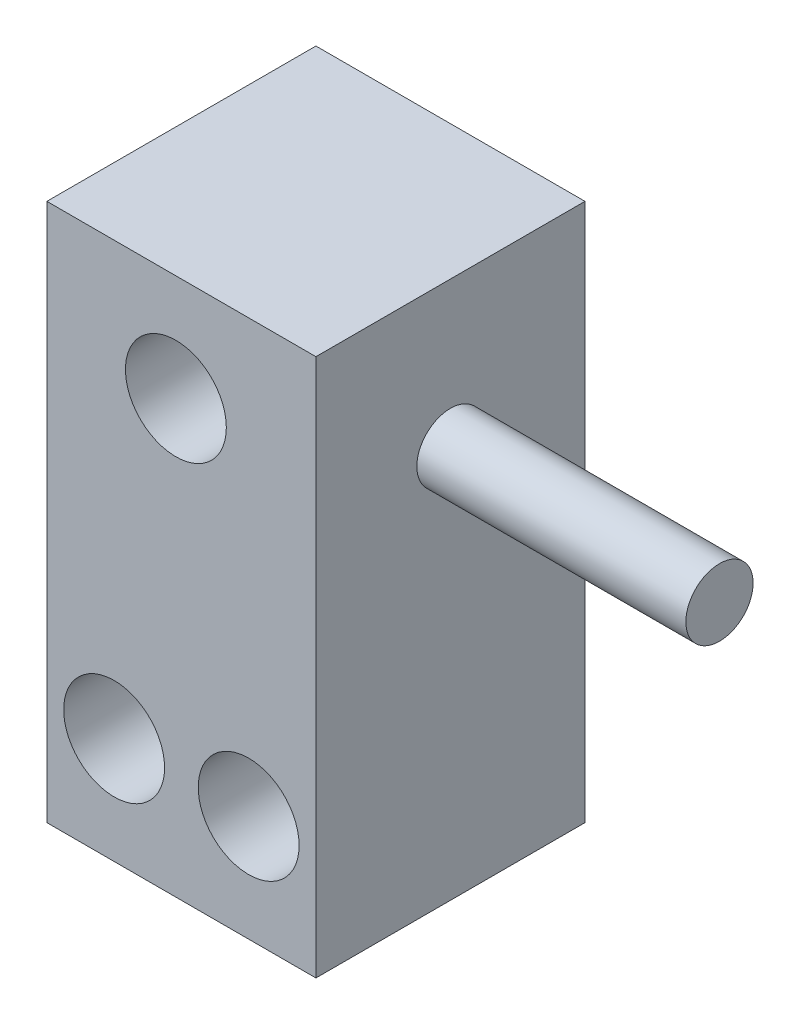
ISO-10303-21;
HEADER;
FILE_DESCRIPTION(('STEP AP214'),'2;1');
FILE_NAME('part.step','',(''),(''),'','','');
FILE_SCHEMA(('AUTOMOTIVE_DESIGN { 1 0 10303 214 1 1 1 1 }'));
ENDSEC;
DATA;
#1=APPLICATION_CONTEXT('core data for automotive mechanical design processes');
#2=APPLICATION_PROTOCOL_DEFINITION('international standard','automotive_design',2000,#1);
#3=PRODUCT_CONTEXT('',#1,'mechanical');
#4=PRODUCT('Part','Part','',(#3));
#5=PRODUCT_RELATED_PRODUCT_CATEGORY('part','',(#4));
#6=PRODUCT_DEFINITION_FORMATION('','',#4);
#7=PRODUCT_DEFINITION_CONTEXT('part definition',#1,'design');
#8=PRODUCT_DEFINITION('design','',#6,#7);
#9=PRODUCT_DEFINITION_SHAPE('','',#8);
#10=(LENGTH_UNIT() NAMED_UNIT(*) SI_UNIT(.MILLI.,.METRE.));
#11=(NAMED_UNIT(*) PLANE_ANGLE_UNIT() SI_UNIT($,.RADIAN.));
#12=(NAMED_UNIT(*) SI_UNIT($,.STERADIAN.) SOLID_ANGLE_UNIT());
#13=UNCERTAINTY_MEASURE_WITH_UNIT(LENGTH_MEASURE(1.E-05),#10,'distance_accuracy_value','');
#14=(GEOMETRIC_REPRESENTATION_CONTEXT(3) GLOBAL_UNCERTAINTY_ASSIGNED_CONTEXT((#13)) GLOBAL_UNIT_ASSIGNED_CONTEXT((#10,
#11,#12)) REPRESENTATION_CONTEXT('',''));
#15=CARTESIAN_POINT('',(0.,0.,0.));
#16=DIRECTION('',(0.,0.,1.));
#17=DIRECTION('',(1.,0.,0.));
#18=AXIS2_PLACEMENT_3D('',#15,#16,#17);
#19=CARTESIAN_POINT('',(0.,0.,20.));
#20=DIRECTION('',(0.,0.,-1.));
#21=DIRECTION('',(-1.,0.,0.));
#22=AXIS2_PLACEMENT_3D('',#19,#20,#21);
#23=PLANE('',#22);
#24=DIRECTION('',(0.,-1.,0.));
#25=VECTOR('',#24,1.);
#26=CARTESIAN_POINT('',(0.,0.,20.));
#27=LINE('',#26,#25);
#28=CARTESIAN_POINT('',(0.,40.,20.));
#29=VERTEX_POINT('',#28);
#30=CARTESIAN_POINT('',(0.,0.,20.));
#31=VERTEX_POINT('',#30);
#32=EDGE_CURVE('E88',#29,#31,#27,.T.);
#33=ORIENTED_EDGE('',*,*,#32,.T.);
#34=DIRECTION('',(1.,0.,0.));
#35=VECTOR('',#34,1.);
#36=CARTESIAN_POINT('',(0.,0.,20.));
#37=LINE('',#36,#35);
#38=CARTESIAN_POINT('',(20.,0.,20.));
#39=VERTEX_POINT('',#38);
#40=EDGE_CURVE('E83',#31,#39,#37,.T.);
#41=ORIENTED_EDGE('',*,*,#40,.T.);
#42=DIRECTION('',(0.,1.,0.));
#43=VECTOR('',#42,1.);
#44=CARTESIAN_POINT('',(20.,0.,20.));
#45=LINE('',#44,#43);
#46=CARTESIAN_POINT('',(20.,40.,20.));
#47=VERTEX_POINT('',#46);
#48=EDGE_CURVE('E86',#39,#47,#45,.T.);
#49=ORIENTED_EDGE('',*,*,#48,.T.);
#50=DIRECTION('',(-1.,0.,0.));
#51=VECTOR('',#50,1.);
#52=CARTESIAN_POINT('',(0.,40.,20.));
#53=LINE('',#52,#51);
#54=EDGE_CURVE('E52',#47,#29,#53,.T.);
#55=ORIENTED_EDGE('',*,*,#54,.T.);
#56=EDGE_LOOP('',(#33,#41,#49,#55));
#57=FACE_BOUND('',#56,.T.);
#58=CARTESIAN_POINT('',(15.,7.90672247993892,20.));
#59=DIRECTION('',(0.,0.,1.));
#60=DIRECTION('',(1.,0.,0.));
#61=AXIS2_PLACEMENT_3D('',#58,#59,#60);
#62=CIRCLE('',#61,3.75);
#63=CARTESIAN_POINT('',(18.75,7.90672247993892,20.));
#64=VERTEX_POINT('',#63);
#65=EDGE_CURVE('E105',#64,#64,#62,.T.);
#66=ORIENTED_EDGE('',*,*,#65,.F.);
#67=EDGE_LOOP('',(#66));
#68=FACE_BOUND('',#67,.T.);
#69=CARTESIAN_POINT('',(5.,7.90672247993892,20.));
#70=DIRECTION('',(0.,0.,1.));
#71=DIRECTION('',(1.,0.,0.));
#72=AXIS2_PLACEMENT_3D('',#69,#70,#71);
#73=CIRCLE('',#72,3.75);
#74=CARTESIAN_POINT('',(8.75,7.90672247993892,20.));
#75=VERTEX_POINT('',#74);
#76=EDGE_CURVE('E135',#75,#75,#73,.T.);
#77=ORIENTED_EDGE('',*,*,#76,.F.);
#78=EDGE_LOOP('',(#77));
#79=FACE_BOUND('',#78,.T.);
#80=CARTESIAN_POINT('',(9.59001599845735,32.1,20.));
#81=DIRECTION('',(0.,0.,1.));
#82=DIRECTION('',(1.,0.,0.));
#83=AXIS2_PLACEMENT_3D('',#80,#81,#82);
#84=CIRCLE('',#83,3.75);
#85=CARTESIAN_POINT('',(13.3400159984574,32.1,20.));
#86=VERTEX_POINT('',#85);
#87=EDGE_CURVE('E126',#86,#86,#84,.T.);
#88=ORIENTED_EDGE('',*,*,#87,.F.);
#89=EDGE_LOOP('',(#88));
#90=FACE_BOUND('',#89,.T.);
#91=ADVANCED_FACE('F35',(#57,#68,#79,#90),#23,.F.);
#92=CARTESIAN_POINT('',(0.,0.,0.));
#93=DIRECTION('',(0.,0.,-1.));
#94=DIRECTION('',(-1.,0.,0.));
#95=AXIS2_PLACEMENT_3D('',#92,#93,#94);
#96=PLANE('',#95);
#97=CARTESIAN_POINT('',(5.,7.90672247993892,0.));
#98=DIRECTION('',(0.,0.,1.));
#99=DIRECTION('',(1.,0.,0.));
#100=AXIS2_PLACEMENT_3D('',#97,#98,#99);
#101=CIRCLE('',#100,3.75);
#102=CARTESIAN_POINT('',(8.75,7.90672247993892,0.));
#103=VERTEX_POINT('',#102);
#104=EDGE_CURVE('E130',#103,#103,#101,.T.);
#105=ORIENTED_EDGE('',*,*,#104,.T.);
#106=EDGE_LOOP('',(#105));
#107=FACE_BOUND('',#106,.T.);
#108=DIRECTION('',(0.,-1.,0.));
#109=VECTOR('',#108,1.);
#110=CARTESIAN_POINT('',(0.,0.,0.));
#111=LINE('',#110,#109);
#112=CARTESIAN_POINT('',(0.,40.,0.));
#113=VERTEX_POINT('',#112);
#114=CARTESIAN_POINT('',(0.,0.,0.));
#115=VERTEX_POINT('',#114);
#116=EDGE_CURVE('E102',#113,#115,#111,.T.);
#117=ORIENTED_EDGE('',*,*,#116,.F.);
#118=DIRECTION('',(-1.,0.,0.));
#119=VECTOR('',#118,1.);
#120=CARTESIAN_POINT('',(0.,40.,0.));
#121=LINE('',#120,#119);
#122=CARTESIAN_POINT('',(20.,40.,0.));
#123=VERTEX_POINT('',#122);
#124=EDGE_CURVE('E75',#123,#113,#121,.T.);
#125=ORIENTED_EDGE('',*,*,#124,.F.);
#126=DIRECTION('',(0.,1.,0.));
#127=VECTOR('',#126,1.);
#128=CARTESIAN_POINT('',(20.,0.,0.));
#129=LINE('',#128,#127);
#130=CARTESIAN_POINT('',(20.,0.,0.));
#131=VERTEX_POINT('',#130);
#132=EDGE_CURVE('E69',#131,#123,#129,.T.);
#133=ORIENTED_EDGE('',*,*,#132,.F.);
#134=DIRECTION('',(1.,0.,0.));
#135=VECTOR('',#134,1.);
#136=CARTESIAN_POINT('',(0.,0.,0.));
#137=LINE('',#136,#135);
#138=EDGE_CURVE('E93',#115,#131,#137,.T.);
#139=ORIENTED_EDGE('',*,*,#138,.F.);
#140=EDGE_LOOP('',(#117,#125,#133,#139));
#141=FACE_BOUND('',#140,.T.);
#142=CARTESIAN_POINT('',(15.,7.90672247993892,0.));
#143=DIRECTION('',(0.,0.,1.));
#144=DIRECTION('',(1.,0.,0.));
#145=AXIS2_PLACEMENT_3D('',#142,#143,#144);
#146=CIRCLE('',#145,3.75);
#147=CARTESIAN_POINT('',(18.75,7.90672247993892,0.));
#148=VERTEX_POINT('',#147);
#149=EDGE_CURVE('E121',#148,#148,#146,.T.);
#150=ORIENTED_EDGE('',*,*,#149,.T.);
#151=EDGE_LOOP('',(#150));
#152=FACE_BOUND('',#151,.T.);
#153=CARTESIAN_POINT('',(9.59001599845735,32.1,0.));
#154=DIRECTION('',(0.,0.,1.));
#155=DIRECTION('',(1.,0.,0.));
#156=AXIS2_PLACEMENT_3D('',#153,#154,#155);
#157=CIRCLE('',#156,3.75);
#158=CARTESIAN_POINT('',(13.3400159984574,32.1,0.));
#159=VERTEX_POINT('',#158);
#160=EDGE_CURVE('E124',#159,#159,#157,.T.);
#161=ORIENTED_EDGE('',*,*,#160,.T.);
#162=EDGE_LOOP('',(#161));
#163=FACE_BOUND('',#162,.T.);
#164=ADVANCED_FACE('F113',(#107,#141,#152,#163),#96,.T.);
#165=CARTESIAN_POINT('',(0.,0.,20.));
#166=DIRECTION('',(1.,0.,0.));
#167=DIRECTION('',(0.,0.,-1.));
#168=AXIS2_PLACEMENT_3D('',#165,#166,#167);
#169=PLANE('',#168);
#170=ORIENTED_EDGE('',*,*,#116,.T.);
#171=DIRECTION('',(0.,0.,-1.));
#172=VECTOR('',#171,1.);
#173=CARTESIAN_POINT('',(0.,0.,20.));
#174=LINE('',#173,#172);
#175=EDGE_CURVE('E44',#31,#115,#174,.T.);
#176=ORIENTED_EDGE('',*,*,#175,.F.);
#177=ORIENTED_EDGE('',*,*,#32,.F.);
#178=DIRECTION('',(0.,0.,-1.));
#179=VECTOR('',#178,1.);
#180=CARTESIAN_POINT('',(0.,40.,20.));
#181=LINE('',#180,#179);
#182=EDGE_CURVE('E98',#29,#113,#181,.T.);
#183=ORIENTED_EDGE('',*,*,#182,.T.);
#184=EDGE_LOOP('',(#170,#176,#177,#183));
#185=FACE_BOUND('',#184,.T.);
#186=ADVANCED_FACE('F37',(#185),#169,.F.);
#187=CARTESIAN_POINT('',(0.,0.,20.));
#188=DIRECTION('',(0.,1.,0.));
#189=DIRECTION('',(0.,0.,1.));
#190=AXIS2_PLACEMENT_3D('',#187,#188,#189);
#191=PLANE('',#190);
#192=ORIENTED_EDGE('',*,*,#138,.T.);
#193=DIRECTION('',(0.,0.,-1.));
#194=VECTOR('',#193,1.);
#195=CARTESIAN_POINT('',(20.,0.,20.));
#196=LINE('',#195,#194);
#197=EDGE_CURVE('E91',#39,#131,#196,.T.);
#198=ORIENTED_EDGE('',*,*,#197,.F.);
#199=ORIENTED_EDGE('',*,*,#40,.F.);
#200=ORIENTED_EDGE('',*,*,#175,.T.);
#201=EDGE_LOOP('',(#192,#198,#199,#200));
#202=FACE_BOUND('',#201,.T.);
#203=ADVANCED_FACE('F92',(#202),#191,.F.);
#204=CARTESIAN_POINT('',(20.,0.,20.));
#205=DIRECTION('',(-1.,0.,0.));
#206=DIRECTION('',(0.,0.,1.));
#207=AXIS2_PLACEMENT_3D('',#204,#205,#206);
#208=PLANE('',#207);
#209=CARTESIAN_POINT('',(20.,29.1762570450195,10.));
#210=DIRECTION('',(-1.,0.,0.));
#211=DIRECTION('',(0.,0.,1.));
#212=AXIS2_PLACEMENT_3D('',#209,#210,#211);
#213=CIRCLE('',#212,2.5);
#214=CARTESIAN_POINT('',(20.,29.1762570450195,12.5));
#215=VERTEX_POINT('',#214);
#216=EDGE_CURVE('E11',#215,#215,#213,.F.);
#217=ORIENTED_EDGE('',*,*,#216,.F.);
#218=EDGE_LOOP('',(#217));
#219=FACE_BOUND('',#218,.T.);
#220=ORIENTED_EDGE('',*,*,#132,.T.);
#221=DIRECTION('',(0.,0.,-1.));
#222=VECTOR('',#221,1.);
#223=CARTESIAN_POINT('',(20.,40.,20.));
#224=LINE('',#223,#222);
#225=EDGE_CURVE('E94',#47,#123,#224,.T.);
#226=ORIENTED_EDGE('',*,*,#225,.F.);
#227=ORIENTED_EDGE('',*,*,#48,.F.);
#228=ORIENTED_EDGE('',*,*,#197,.T.);
#229=EDGE_LOOP('',(#220,#226,#227,#228));
#230=FACE_BOUND('',#229,.T.);
#231=ADVANCED_FACE('F96',(#219,#230),#208,.F.);
#232=CARTESIAN_POINT('',(0.,40.,20.));
#233=DIRECTION('',(0.,-1.,0.));
#234=DIRECTION('',(0.,0.,-1.));
#235=AXIS2_PLACEMENT_3D('',#232,#233,#234);
#236=PLANE('',#235);
#237=ORIENTED_EDGE('',*,*,#124,.T.);
#238=ORIENTED_EDGE('',*,*,#182,.F.);
#239=ORIENTED_EDGE('',*,*,#54,.F.);
#240=ORIENTED_EDGE('',*,*,#225,.T.);
#241=EDGE_LOOP('',(#237,#238,#239,#240));
#242=FACE_BOUND('',#241,.T.);
#243=ADVANCED_FACE('F170',(#242),#236,.F.);
#244=CARTESIAN_POINT('',(15.,7.90672247993892,20.));
#245=DIRECTION('',(0.,0.,-1.));
#246=DIRECTION('',(-1.,0.,0.));
#247=AXIS2_PLACEMENT_3D('',#244,#245,#246);
#248=CYLINDRICAL_SURFACE('',#247,3.75);
#249=ORIENTED_EDGE('',*,*,#65,.T.);
#250=EDGE_LOOP('',(#249));
#251=FACE_BOUND('',#250,.T.);
#252=ORIENTED_EDGE('',*,*,#149,.F.);
#253=EDGE_LOOP('',(#252));
#254=FACE_BOUND('',#253,.T.);
#255=ADVANCED_FACE('F144',(#251,#254),#248,.F.);
#256=CARTESIAN_POINT('',(5.,7.90672247993892,20.));
#257=DIRECTION('',(0.,0.,-1.));
#258=DIRECTION('',(-1.,0.,0.));
#259=AXIS2_PLACEMENT_3D('',#256,#257,#258);
#260=CYLINDRICAL_SURFACE('',#259,3.75);
#261=ORIENTED_EDGE('',*,*,#76,.T.);
#262=EDGE_LOOP('',(#261));
#263=FACE_BOUND('',#262,.T.);
#264=ORIENTED_EDGE('',*,*,#104,.F.);
#265=EDGE_LOOP('',(#264));
#266=FACE_BOUND('',#265,.T.);
#267=ADVANCED_FACE('F156',(#263,#266),#260,.F.);
#268=CARTESIAN_POINT('',(9.59001599845735,32.1,20.));
#269=DIRECTION('',(0.,0.,-1.));
#270=DIRECTION('',(-1.,0.,0.));
#271=AXIS2_PLACEMENT_3D('',#268,#269,#270);
#272=CYLINDRICAL_SURFACE('',#271,3.75);
#273=ORIENTED_EDGE('',*,*,#87,.T.);
#274=EDGE_LOOP('',(#273));
#275=FACE_BOUND('',#274,.T.);
#276=ORIENTED_EDGE('',*,*,#160,.F.);
#277=EDGE_LOOP('',(#276));
#278=FACE_BOUND('',#277,.T.);
#279=ADVANCED_FACE('F153',(#275,#278),#272,.F.);
#280=CARTESIAN_POINT('',(40.,29.1762570450195,10.));
#281=DIRECTION('',(-1.,0.,0.));
#282=DIRECTION('',(0.,0.,1.));
#283=AXIS2_PLACEMENT_3D('',#280,#281,#282);
#284=CYLINDRICAL_SURFACE('',#283,2.5);
#285=CARTESIAN_POINT('',(40.,29.1762570450195,10.));
#286=DIRECTION('',(1.,0.,0.));
#287=DIRECTION('',(0.,0.,-1.));
#288=AXIS2_PLACEMENT_3D('',#285,#286,#287);
#289=CIRCLE('',#288,2.5);
#290=CARTESIAN_POINT('',(40.,29.1762570450195,7.5));
#291=VERTEX_POINT('',#290);
#292=EDGE_CURVE('E127',#291,#291,#289,.T.);
#293=ORIENTED_EDGE('',*,*,#292,.F.);
#294=EDGE_LOOP('',(#293));
#295=FACE_BOUND('',#294,.T.);
#296=ORIENTED_EDGE('',*,*,#216,.T.);
#297=EDGE_LOOP('',(#296));
#298=FACE_BOUND('',#297,.T.);
#299=ADVANCED_FACE('F155',(#295,#298),#284,.T.);
#300=CARTESIAN_POINT('',(40.,29.1762570450195,10.));
#301=DIRECTION('',(1.,0.,0.));
#302=DIRECTION('',(0.,0.,-1.));
#303=AXIS2_PLACEMENT_3D('',#300,#301,#302);
#304=PLANE('',#303);
#305=ORIENTED_EDGE('',*,*,#292,.T.);
#306=EDGE_LOOP('',(#305));
#307=FACE_BOUND('',#306,.T.);
#308=ADVANCED_FACE('F162',(#307),#304,.T.);
#309=CLOSED_SHELL('',(#91,#164,#186,#203,#231,#243,#255,#267,#279,#299,#308));
#310=MANIFOLD_SOLID_BREP('B2',#309);
#311=ADVANCED_BREP_SHAPE_REPRESENTATION('',(#18,#310),#14);
#312=SHAPE_DEFINITION_REPRESENTATION(#9,#311);
ENDSEC;
END-ISO-10303-21;
